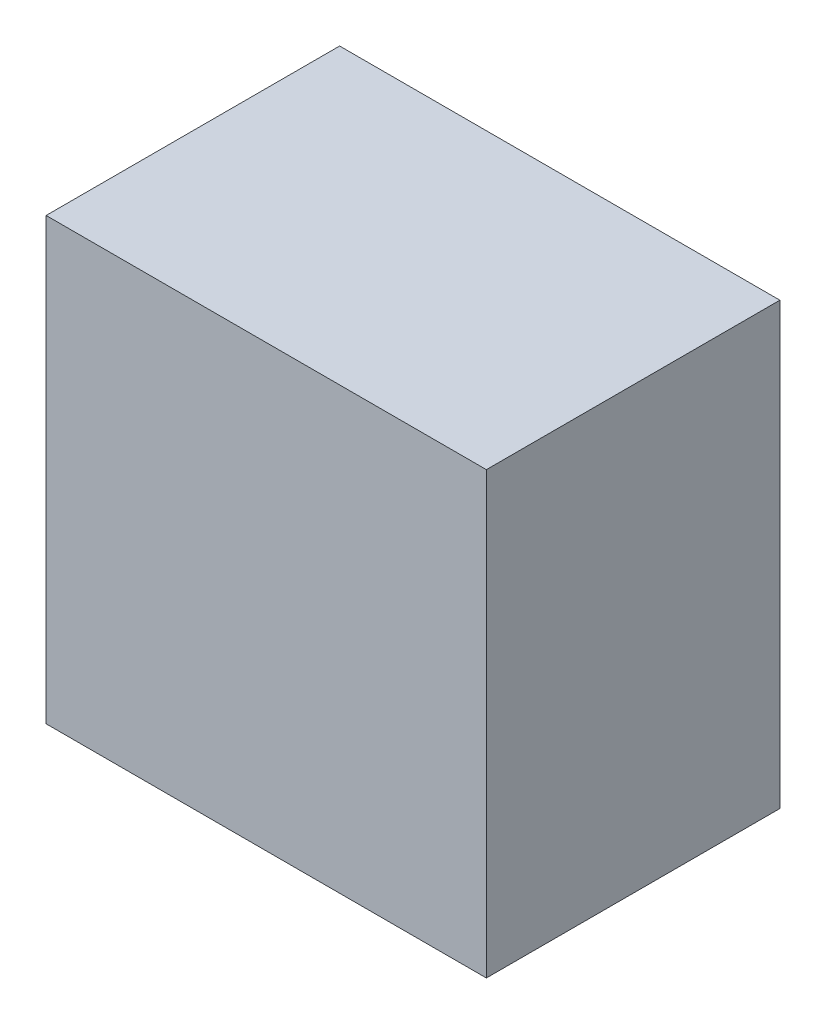
ISO-10303-21;
HEADER;
FILE_DESCRIPTION(('STEP AP214'),'2;1');
FILE_NAME('part.step','',(''),(''),'','','');
FILE_SCHEMA(('AUTOMOTIVE_DESIGN { 1 0 10303 214 1 1 1 1 }'));
ENDSEC;
DATA;
#1=APPLICATION_CONTEXT('core data for automotive mechanical design processes');
#2=APPLICATION_PROTOCOL_DEFINITION('international standard','automotive_design',2000,#1);
#3=PRODUCT_CONTEXT('',#1,'mechanical');
#4=PRODUCT('Part','Part','',(#3));
#5=PRODUCT_RELATED_PRODUCT_CATEGORY('part','',(#4));
#6=PRODUCT_DEFINITION_FORMATION('','',#4);
#7=PRODUCT_DEFINITION_CONTEXT('part definition',#1,'design');
#8=PRODUCT_DEFINITION('design','',#6,#7);
#9=PRODUCT_DEFINITION_SHAPE('','',#8);
#10=(LENGTH_UNIT() NAMED_UNIT(*) SI_UNIT(.MILLI.,.METRE.));
#11=(NAMED_UNIT(*) PLANE_ANGLE_UNIT() SI_UNIT($,.RADIAN.));
#12=(NAMED_UNIT(*) SI_UNIT($,.STERADIAN.) SOLID_ANGLE_UNIT());
#13=UNCERTAINTY_MEASURE_WITH_UNIT(LENGTH_MEASURE(1.E-05),#10,'distance_accuracy_value','');
#14=(GEOMETRIC_REPRESENTATION_CONTEXT(3) GLOBAL_UNCERTAINTY_ASSIGNED_CONTEXT((#13)) GLOBAL_UNIT_ASSIGNED_CONTEXT((#10,
#11,#12)) REPRESENTATION_CONTEXT('',''));
#15=CARTESIAN_POINT('',(0.,0.,0.));
#16=DIRECTION('',(0.,0.,1.));
#17=DIRECTION('',(1.,0.,0.));
#18=AXIS2_PLACEMENT_3D('',#15,#16,#17);
#19=CARTESIAN_POINT('',(27.,27.,18.));
#20=DIRECTION('',(-1.,0.,0.));
#21=DIRECTION('',(0.,-1.,0.));
#22=AXIS2_PLACEMENT_3D('',#19,#20,#21);
#23=PLANE('',#22);
#24=DIRECTION('',(0.,1.,0.));
#25=VECTOR('',#24,1.);
#26=CARTESIAN_POINT('',(27.,27.,-18.));
#27=LINE('',#26,#25);
#28=CARTESIAN_POINT('',(27.,-27.,-18.));
#29=VERTEX_POINT('',#28);
#30=CARTESIAN_POINT('',(27.,27.,-18.));
#31=VERTEX_POINT('',#30);
#32=EDGE_CURVE('E102',#29,#31,#27,.T.);
#33=ORIENTED_EDGE('',*,*,#32,.T.);
#34=DIRECTION('',(0.,0.,-1.));
#35=VECTOR('',#34,1.);
#36=CARTESIAN_POINT('',(27.,27.,18.));
#37=LINE('',#36,#35);
#38=CARTESIAN_POINT('',(27.,27.,18.));
#39=VERTEX_POINT('',#38);
#40=EDGE_CURVE('E11',#39,#31,#37,.T.);
#41=ORIENTED_EDGE('',*,*,#40,.F.);
#42=DIRECTION('',(0.,1.,0.));
#43=VECTOR('',#42,1.);
#44=CARTESIAN_POINT('',(27.,27.,18.));
#45=LINE('',#44,#43);
#46=CARTESIAN_POINT('',(27.,-27.,18.));
#47=VERTEX_POINT('',#46);
#48=EDGE_CURVE('E90',#47,#39,#45,.T.);
#49=ORIENTED_EDGE('',*,*,#48,.F.);
#50=DIRECTION('',(0.,0.,-1.));
#51=VECTOR('',#50,1.);
#52=CARTESIAN_POINT('',(27.,-27.,18.));
#53=LINE('',#52,#51);
#54=EDGE_CURVE('E98',#47,#29,#53,.T.);
#55=ORIENTED_EDGE('',*,*,#54,.T.);
#56=EDGE_LOOP('',(#33,#41,#49,#55));
#57=FACE_BOUND('',#56,.T.);
#58=ADVANCED_FACE('F39',(#57),#23,.F.);
#59=CARTESIAN_POINT('',(-27.,27.,18.));
#60=DIRECTION('',(0.,-1.,0.));
#61=DIRECTION('',(0.,0.,-1.));
#62=AXIS2_PLACEMENT_3D('',#59,#60,#61);
#63=PLANE('',#62);
#64=DIRECTION('',(-1.,0.,0.));
#65=VECTOR('',#64,1.);
#66=CARTESIAN_POINT('',(-27.,27.,-18.));
#67=LINE('',#66,#65);
#68=CARTESIAN_POINT('',(-27.,27.,-18.));
#69=VERTEX_POINT('',#68);
#70=EDGE_CURVE('E94',#31,#69,#67,.T.);
#71=ORIENTED_EDGE('',*,*,#70,.T.);
#72=DIRECTION('',(0.,0.,-1.));
#73=VECTOR('',#72,1.);
#74=CARTESIAN_POINT('',(-27.,27.,18.));
#75=LINE('',#74,#73);
#76=CARTESIAN_POINT('',(-27.,27.,18.));
#77=VERTEX_POINT('',#76);
#78=EDGE_CURVE('E47',#77,#69,#75,.T.);
#79=ORIENTED_EDGE('',*,*,#78,.F.);
#80=DIRECTION('',(-1.,0.,0.));
#81=VECTOR('',#80,1.);
#82=CARTESIAN_POINT('',(-27.,27.,18.));
#83=LINE('',#82,#81);
#84=EDGE_CURVE('E85',#39,#77,#83,.T.);
#85=ORIENTED_EDGE('',*,*,#84,.F.);
#86=ORIENTED_EDGE('',*,*,#40,.T.);
#87=EDGE_LOOP('',(#71,#79,#85,#86));
#88=FACE_BOUND('',#87,.T.);
#89=ADVANCED_FACE('F93',(#88),#63,.F.);
#90=CARTESIAN_POINT('',(-27.,27.,18.));
#91=DIRECTION('',(1.,0.,0.));
#92=DIRECTION('',(0.,1.,0.));
#93=AXIS2_PLACEMENT_3D('',#90,#91,#92);
#94=PLANE('',#93);
#95=DIRECTION('',(0.,-1.,0.));
#96=VECTOR('',#95,1.);
#97=CARTESIAN_POINT('',(-27.,27.,-18.));
#98=LINE('',#97,#96);
#99=CARTESIAN_POINT('',(-27.,-27.,-18.));
#100=VERTEX_POINT('',#99);
#101=EDGE_CURVE('E72',#69,#100,#98,.T.);
#102=ORIENTED_EDGE('',*,*,#101,.T.);
#103=DIRECTION('',(0.,0.,-1.));
#104=VECTOR('',#103,1.);
#105=CARTESIAN_POINT('',(-27.,-27.,18.));
#106=LINE('',#105,#104);
#107=CARTESIAN_POINT('',(-27.,-27.,18.));
#108=VERTEX_POINT('',#107);
#109=EDGE_CURVE('E95',#108,#100,#106,.T.);
#110=ORIENTED_EDGE('',*,*,#109,.F.);
#111=DIRECTION('',(0.,-1.,0.));
#112=VECTOR('',#111,1.);
#113=CARTESIAN_POINT('',(-27.,27.,18.));
#114=LINE('',#113,#112);
#115=EDGE_CURVE('E88',#77,#108,#114,.T.);
#116=ORIENTED_EDGE('',*,*,#115,.F.);
#117=ORIENTED_EDGE('',*,*,#78,.T.);
#118=EDGE_LOOP('',(#102,#110,#116,#117));
#119=FACE_BOUND('',#118,.T.);
#120=ADVANCED_FACE('F96',(#119),#94,.F.);
#121=CARTESIAN_POINT('',(-27.,-27.,18.));
#122=DIRECTION('',(0.,1.,0.));
#123=DIRECTION('',(0.,0.,1.));
#124=AXIS2_PLACEMENT_3D('',#121,#122,#123);
#125=PLANE('',#124);
#126=DIRECTION('',(1.,0.,0.));
#127=VECTOR('',#126,1.);
#128=CARTESIAN_POINT('',(-27.,-27.,-18.));
#129=LINE('',#128,#127);
#130=EDGE_CURVE('E78',#100,#29,#129,.T.);
#131=ORIENTED_EDGE('',*,*,#130,.T.);
#132=ORIENTED_EDGE('',*,*,#54,.F.);
#133=DIRECTION('',(1.,0.,0.));
#134=VECTOR('',#133,1.);
#135=CARTESIAN_POINT('',(-27.,-27.,18.));
#136=LINE('',#135,#134);
#137=EDGE_CURVE('E55',#108,#47,#136,.T.);
#138=ORIENTED_EDGE('',*,*,#137,.F.);
#139=ORIENTED_EDGE('',*,*,#109,.T.);
#140=EDGE_LOOP('',(#131,#132,#138,#139));
#141=FACE_BOUND('',#140,.T.);
#142=ADVANCED_FACE('F109',(#141),#125,.F.);
#143=CARTESIAN_POINT('',(0.,0.,18.));
#144=DIRECTION('',(0.,0.,1.));
#145=DIRECTION('',(1.,0.,0.));
#146=AXIS2_PLACEMENT_3D('',#143,#144,#145);
#147=PLANE('',#146);
#148=ORIENTED_EDGE('',*,*,#48,.T.);
#149=ORIENTED_EDGE('',*,*,#84,.T.);
#150=ORIENTED_EDGE('',*,*,#115,.T.);
#151=ORIENTED_EDGE('',*,*,#137,.T.);
#152=EDGE_LOOP('',(#148,#149,#150,#151));
#153=FACE_BOUND('',#152,.T.);
#154=ADVANCED_FACE('F86',(#153),#147,.T.);
#155=CARTESIAN_POINT('',(0.,0.,-18.));
#156=DIRECTION('',(0.,0.,1.));
#157=DIRECTION('',(1.,0.,0.));
#158=AXIS2_PLACEMENT_3D('',#155,#156,#157);
#159=PLANE('',#158);
#160=ORIENTED_EDGE('',*,*,#32,.F.);
#161=ORIENTED_EDGE('',*,*,#130,.F.);
#162=ORIENTED_EDGE('',*,*,#101,.F.);
#163=ORIENTED_EDGE('',*,*,#70,.F.);
#164=EDGE_LOOP('',(#160,#161,#162,#163));
#165=FACE_BOUND('',#164,.T.);
#166=ADVANCED_FACE('F112',(#165),#159,.F.);
#167=CLOSED_SHELL('',(#58,#89,#120,#142,#154,#166));
#168=MANIFOLD_SOLID_BREP('B2',#167);
#169=ADVANCED_BREP_SHAPE_REPRESENTATION('',(#18,#168),#14);
#170=SHAPE_DEFINITION_REPRESENTATION(#9,#169);
ENDSEC;
END-ISO-10303-21;
